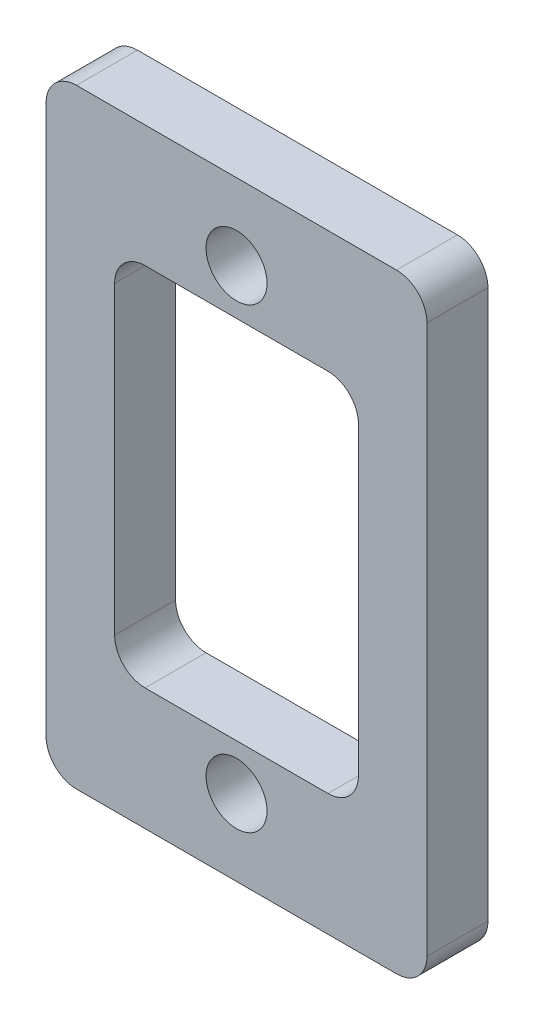
ISO-10303-21;
HEADER;
FILE_DESCRIPTION(('STEP AP214'),'2;1');
FILE_NAME('part.step','',(''),(''),'','','');
FILE_SCHEMA(('AUTOMOTIVE_DESIGN { 1 0 10303 214 1 1 1 1 }'));
ENDSEC;
DATA;
#1=APPLICATION_CONTEXT('core data for automotive mechanical design processes');
#2=APPLICATION_PROTOCOL_DEFINITION('international standard','automotive_design',2000,#1);
#3=PRODUCT_CONTEXT('',#1,'mechanical');
#4=PRODUCT('Part','Part','',(#3));
#5=PRODUCT_RELATED_PRODUCT_CATEGORY('part','',(#4));
#6=PRODUCT_DEFINITION_FORMATION('','',#4);
#7=PRODUCT_DEFINITION_CONTEXT('part definition',#1,'design');
#8=PRODUCT_DEFINITION('design','',#6,#7);
#9=PRODUCT_DEFINITION_SHAPE('','',#8);
#10=(LENGTH_UNIT() NAMED_UNIT(*) SI_UNIT(.MILLI.,.METRE.));
#11=(NAMED_UNIT(*) PLANE_ANGLE_UNIT() SI_UNIT($,.RADIAN.));
#12=(NAMED_UNIT(*) SI_UNIT($,.STERADIAN.) SOLID_ANGLE_UNIT());
#13=UNCERTAINTY_MEASURE_WITH_UNIT(LENGTH_MEASURE(1.E-05),#10,'distance_accuracy_value','');
#14=(GEOMETRIC_REPRESENTATION_CONTEXT(3) GLOBAL_UNCERTAINTY_ASSIGNED_CONTEXT((#13)) GLOBAL_UNIT_ASSIGNED_CONTEXT((#10,
#11,#12)) REPRESENTATION_CONTEXT('',''));
#15=CARTESIAN_POINT('',(0.,0.,0.));
#16=DIRECTION('',(0.,0.,1.));
#17=DIRECTION('',(1.,0.,0.));
#18=AXIS2_PLACEMENT_3D('',#15,#16,#17);
#19=CARTESIAN_POINT('',(12.5,-20.,4.));
#20=DIRECTION('',(-1.,0.,0.));
#21=DIRECTION('',(0.,0.,1.));
#22=AXIS2_PLACEMENT_3D('',#19,#20,#21);
#23=PLANE('',#22);
#24=DIRECTION('',(0.,1.,0.));
#25=VECTOR('',#24,1.);
#26=CARTESIAN_POINT('',(12.5,-20.,4.));
#27=LINE('',#26,#25);
#28=CARTESIAN_POINT('',(12.5,-18.,4.));
#29=VERTEX_POINT('',#28);
#30=CARTESIAN_POINT('',(12.5,18.,4.));
#31=VERTEX_POINT('',#30);
#32=EDGE_CURVE('E167',#29,#31,#27,.T.);
#33=ORIENTED_EDGE('',*,*,#32,.F.);
#34=DIRECTION('',(0.,0.,-1.));
#35=VECTOR('',#34,1.);
#36=CARTESIAN_POINT('',(12.5,-18.,4.));
#37=LINE('',#36,#35);
#38=CARTESIAN_POINT('',(12.5,-18.,0.));
#39=VERTEX_POINT('',#38);
#40=EDGE_CURVE('E152',#29,#39,#37,.T.);
#41=ORIENTED_EDGE('',*,*,#40,.T.);
#42=DIRECTION('',(0.,1.,0.));
#43=VECTOR('',#42,1.);
#44=CARTESIAN_POINT('',(12.5,-20.,0.));
#45=LINE('',#44,#43);
#46=CARTESIAN_POINT('',(12.5,18.,0.));
#47=VERTEX_POINT('',#46);
#48=EDGE_CURVE('E164',#39,#47,#45,.T.);
#49=ORIENTED_EDGE('',*,*,#48,.T.);
#50=DIRECTION('',(0.,0.,-1.));
#51=VECTOR('',#50,1.);
#52=CARTESIAN_POINT('',(12.5,18.,4.));
#53=LINE('',#52,#51);
#54=EDGE_CURVE('E169',#47,#31,#53,.F.);
#55=ORIENTED_EDGE('',*,*,#54,.T.);
#56=EDGE_LOOP('',(#33,#41,#49,#55));
#57=FACE_BOUND('',#56,.T.);
#58=ADVANCED_FACE('F35',(#57),#23,.F.);
#59=CARTESIAN_POINT('',(-12.5,20.,4.));
#60=DIRECTION('',(0.,-1.,0.));
#61=DIRECTION('',(0.,0.,-1.));
#62=AXIS2_PLACEMENT_3D('',#59,#60,#61);
#63=PLANE('',#62);
#64=DIRECTION('',(-1.,0.,0.));
#65=VECTOR('',#64,1.);
#66=CARTESIAN_POINT('',(-12.5,20.,0.));
#67=LINE('',#66,#65);
#68=CARTESIAN_POINT('',(10.5,20.,0.));
#69=VERTEX_POINT('',#68);
#70=CARTESIAN_POINT('',(-10.5,20.,0.));
#71=VERTEX_POINT('',#70);
#72=EDGE_CURVE('E173',#69,#71,#67,.T.);
#73=ORIENTED_EDGE('',*,*,#72,.T.);
#74=DIRECTION('',(0.,0.,-1.));
#75=VECTOR('',#74,1.);
#76=CARTESIAN_POINT('',(-10.5,20.,4.));
#77=LINE('',#76,#75);
#78=CARTESIAN_POINT('',(-10.5,20.,4.));
#79=VERTEX_POINT('',#78);
#80=EDGE_CURVE('E217',#71,#79,#77,.F.);
#81=ORIENTED_EDGE('',*,*,#80,.T.);
#82=DIRECTION('',(-1.,0.,0.));
#83=VECTOR('',#82,1.);
#84=CARTESIAN_POINT('',(-12.5,20.,4.));
#85=LINE('',#84,#83);
#86=CARTESIAN_POINT('',(10.5,20.,4.));
#87=VERTEX_POINT('',#86);
#88=EDGE_CURVE('E312',#87,#79,#85,.T.);
#89=ORIENTED_EDGE('',*,*,#88,.F.);
#90=DIRECTION('',(0.,0.,-1.));
#91=VECTOR('',#90,1.);
#92=CARTESIAN_POINT('',(10.5,20.,4.));
#93=LINE('',#92,#91);
#94=EDGE_CURVE('E214',#87,#69,#93,.T.);
#95=ORIENTED_EDGE('',*,*,#94,.T.);
#96=EDGE_LOOP('',(#73,#81,#89,#95));
#97=FACE_BOUND('',#96,.T.);
#98=ADVANCED_FACE('F336',(#97),#63,.F.);
#99=CARTESIAN_POINT('',(-12.5,-20.,4.));
#100=DIRECTION('',(1.,0.,0.));
#101=DIRECTION('',(0.,0.,-1.));
#102=AXIS2_PLACEMENT_3D('',#99,#100,#101);
#103=PLANE('',#102);
#104=DIRECTION('',(0.,-1.,0.));
#105=VECTOR('',#104,1.);
#106=CARTESIAN_POINT('',(-12.5,-20.,0.));
#107=LINE('',#106,#105);
#108=CARTESIAN_POINT('',(-12.5,18.,0.));
#109=VERTEX_POINT('',#108);
#110=CARTESIAN_POINT('',(-12.5,-18.,0.));
#111=VERTEX_POINT('',#110);
#112=EDGE_CURVE('E177',#109,#111,#107,.T.);
#113=ORIENTED_EDGE('',*,*,#112,.T.);
#114=DIRECTION('',(0.,0.,-1.));
#115=VECTOR('',#114,1.);
#116=CARTESIAN_POINT('',(-12.5,-18.,4.));
#117=LINE('',#116,#115);
#118=CARTESIAN_POINT('',(-12.5,-18.,4.));
#119=VERTEX_POINT('',#118);
#120=EDGE_CURVE('E212',#111,#119,#117,.F.);
#121=ORIENTED_EDGE('',*,*,#120,.T.);
#122=DIRECTION('',(0.,-1.,0.));
#123=VECTOR('',#122,1.);
#124=CARTESIAN_POINT('',(-12.5,-20.,4.));
#125=LINE('',#124,#123);
#126=CARTESIAN_POINT('',(-12.5,18.,4.));
#127=VERTEX_POINT('',#126);
#128=EDGE_CURVE('E314',#127,#119,#125,.T.);
#129=ORIENTED_EDGE('',*,*,#128,.F.);
#130=DIRECTION('',(0.,0.,-1.));
#131=VECTOR('',#130,1.);
#132=CARTESIAN_POINT('',(-12.5,18.,4.));
#133=LINE('',#132,#131);
#134=EDGE_CURVE('E209',#127,#109,#133,.T.);
#135=ORIENTED_EDGE('',*,*,#134,.T.);
#136=EDGE_LOOP('',(#113,#121,#129,#135));
#137=FACE_BOUND('',#136,.T.);
#138=ADVANCED_FACE('F329',(#137),#103,.F.);
#139=CARTESIAN_POINT('',(-12.5,-20.,4.));
#140=DIRECTION('',(0.,1.,0.));
#141=DIRECTION('',(0.,0.,1.));
#142=AXIS2_PLACEMENT_3D('',#139,#140,#141);
#143=PLANE('',#142);
#144=DIRECTION('',(1.,0.,0.));
#145=VECTOR('',#144,1.);
#146=CARTESIAN_POINT('',(-12.5,-20.,0.));
#147=LINE('',#146,#145);
#148=CARTESIAN_POINT('',(-10.5,-20.,0.));
#149=VERTEX_POINT('',#148);
#150=CARTESIAN_POINT('',(10.5,-20.,0.));
#151=VERTEX_POINT('',#150);
#152=EDGE_CURVE('E188',#149,#151,#147,.T.);
#153=ORIENTED_EDGE('',*,*,#152,.T.);
#154=DIRECTION('',(0.,0.,-1.));
#155=VECTOR('',#154,1.);
#156=CARTESIAN_POINT('',(10.5,-20.,4.));
#157=LINE('',#156,#155);
#158=CARTESIAN_POINT('',(10.5,-20.,4.));
#159=VERTEX_POINT('',#158);
#160=EDGE_CURVE('E153',#151,#159,#157,.F.);
#161=ORIENTED_EDGE('',*,*,#160,.T.);
#162=DIRECTION('',(1.,0.,0.));
#163=VECTOR('',#162,1.);
#164=CARTESIAN_POINT('',(-12.5,-20.,4.));
#165=LINE('',#164,#163);
#166=CARTESIAN_POINT('',(-10.5,-20.,4.));
#167=VERTEX_POINT('',#166);
#168=EDGE_CURVE('E183',#167,#159,#165,.T.);
#169=ORIENTED_EDGE('',*,*,#168,.F.);
#170=DIRECTION('',(0.,0.,-1.));
#171=VECTOR('',#170,1.);
#172=CARTESIAN_POINT('',(-10.5,-20.,4.));
#173=LINE('',#172,#171);
#174=EDGE_CURVE('E158',#167,#149,#173,.T.);
#175=ORIENTED_EDGE('',*,*,#174,.T.);
#176=EDGE_LOOP('',(#153,#161,#169,#175));
#177=FACE_BOUND('',#176,.T.);
#178=ADVANCED_FACE('F323',(#177),#143,.F.);
#179=CARTESIAN_POINT('',(0.,0.,4.));
#180=DIRECTION('',(0.,0.,-1.));
#181=DIRECTION('',(-1.,0.,0.));
#182=AXIS2_PLACEMENT_3D('',#179,#180,#181);
#183=PLANE('',#182);
#184=DIRECTION('',(-1.,0.,0.));
#185=VECTOR('',#184,1.);
#186=CARTESIAN_POINT('',(-8.,12.,4.));
#187=LINE('',#186,#185);
#188=CARTESIAN_POINT('',(6.,12.,4.));
#189=VERTEX_POINT('',#188);
#190=CARTESIAN_POINT('',(-6.,12.,4.));
#191=VERTEX_POINT('',#190);
#192=EDGE_CURVE('E271',#189,#191,#187,.T.);
#193=ORIENTED_EDGE('',*,*,#192,.F.);
#194=CARTESIAN_POINT('',(6.,10.,4.));
#195=DIRECTION('',(0.,0.,-1.));
#196=DIRECTION('',(-1.,0.,0.));
#197=AXIS2_PLACEMENT_3D('',#194,#195,#196);
#198=CIRCLE('',#197,2.);
#199=CARTESIAN_POINT('',(8.,10.,4.));
#200=VERTEX_POINT('',#199);
#201=EDGE_CURVE('E254',#189,#200,#198,.T.);
#202=ORIENTED_EDGE('',*,*,#201,.T.);
#203=DIRECTION('',(0.,1.,0.));
#204=VECTOR('',#203,1.);
#205=CARTESIAN_POINT('',(8.,-12.,4.));
#206=LINE('',#205,#204);
#207=CARTESIAN_POINT('',(8.,-10.,4.));
#208=VERTEX_POINT('',#207);
#209=EDGE_CURVE('E290',#208,#200,#206,.T.);
#210=ORIENTED_EDGE('',*,*,#209,.F.);
#211=CARTESIAN_POINT('',(6.,-10.,4.));
#212=DIRECTION('',(0.,0.,-1.));
#213=DIRECTION('',(-1.,0.,0.));
#214=AXIS2_PLACEMENT_3D('',#211,#212,#213);
#215=CIRCLE('',#214,2.);
#216=CARTESIAN_POINT('',(6.,-12.,4.));
#217=VERTEX_POINT('',#216);
#218=EDGE_CURVE('E50',#208,#217,#215,.T.);
#219=ORIENTED_EDGE('',*,*,#218,.T.);
#220=DIRECTION('',(1.,0.,0.));
#221=VECTOR('',#220,1.);
#222=CARTESIAN_POINT('',(-7.99999999999999,-12.,4.));
#223=LINE('',#222,#221);
#224=CARTESIAN_POINT('',(-5.99999999999999,-12.,4.));
#225=VERTEX_POINT('',#224);
#226=EDGE_CURVE('E266',#225,#217,#223,.T.);
#227=ORIENTED_EDGE('',*,*,#226,.F.);
#228=CARTESIAN_POINT('',(-5.99999999999999,-10.,4.));
#229=DIRECTION('',(0.,0.,-1.));
#230=DIRECTION('',(-1.,0.,0.));
#231=AXIS2_PLACEMENT_3D('',#228,#229,#230);
#232=CIRCLE('',#231,2.);
#233=CARTESIAN_POINT('',(-7.99999999999999,-10.,4.));
#234=VERTEX_POINT('',#233);
#235=EDGE_CURVE('E43',#225,#234,#232,.T.);
#236=ORIENTED_EDGE('',*,*,#235,.T.);
#237=DIRECTION('',(0.,-1.,0.));
#238=VECTOR('',#237,1.);
#239=CARTESIAN_POINT('',(-7.99999999999999,-12.,4.));
#240=LINE('',#239,#238);
#241=CARTESIAN_POINT('',(-8.,10.,4.));
#242=VERTEX_POINT('',#241);
#243=EDGE_CURVE('E265',#242,#234,#240,.T.);
#244=ORIENTED_EDGE('',*,*,#243,.F.);
#245=CARTESIAN_POINT('',(-6.,10.,4.));
#246=DIRECTION('',(0.,0.,-1.));
#247=DIRECTION('',(-1.,0.,0.));
#248=AXIS2_PLACEMENT_3D('',#245,#246,#247);
#249=CIRCLE('',#248,2.);
#250=EDGE_CURVE('E250',#242,#191,#249,.T.);
#251=ORIENTED_EDGE('',*,*,#250,.T.);
#252=EDGE_LOOP('',(#193,#202,#210,#219,#227,#236,#244,#251));
#253=FACE_BOUND('',#252,.T.);
#254=CARTESIAN_POINT('',(0.,15.,4.));
#255=DIRECTION('',(0.,0.,1.));
#256=DIRECTION('',(1.,0.,0.));
#257=AXIS2_PLACEMENT_3D('',#254,#255,#256);
#258=CIRCLE('',#257,2.);
#259=CARTESIAN_POINT('',(1.99999999999999,15.,4.));
#260=VERTEX_POINT('',#259);
#261=EDGE_CURVE('E191',#260,#260,#258,.T.);
#262=ORIENTED_EDGE('',*,*,#261,.F.);
#263=EDGE_LOOP('',(#262));
#264=FACE_BOUND('',#263,.T.);
#265=CARTESIAN_POINT('',(0.,-15.,4.));
#266=DIRECTION('',(0.,0.,1.));
#267=DIRECTION('',(1.,0.,0.));
#268=AXIS2_PLACEMENT_3D('',#265,#266,#267);
#269=CIRCLE('',#268,2.);
#270=CARTESIAN_POINT('',(2.,-15.,4.));
#271=VERTEX_POINT('',#270);
#272=EDGE_CURVE('E306',#271,#271,#269,.T.);
#273=ORIENTED_EDGE('',*,*,#272,.F.);
#274=EDGE_LOOP('',(#273));
#275=FACE_BOUND('',#274,.T.);
#276=ORIENTED_EDGE('',*,*,#168,.T.);
#277=CARTESIAN_POINT('',(10.5,-18.,4.));
#278=DIRECTION('',(0.,0.,-1.));
#279=DIRECTION('',(-1.,0.,0.));
#280=AXIS2_PLACEMENT_3D('',#277,#278,#279);
#281=CIRCLE('',#280,2.);
#282=EDGE_CURVE('E207',#159,#29,#281,.F.);
#283=ORIENTED_EDGE('',*,*,#282,.T.);
#284=ORIENTED_EDGE('',*,*,#32,.T.);
#285=CARTESIAN_POINT('',(10.5,18.,4.));
#286=DIRECTION('',(0.,0.,-1.));
#287=DIRECTION('',(-1.,0.,0.));
#288=AXIS2_PLACEMENT_3D('',#285,#286,#287);
#289=CIRCLE('',#288,2.);
#290=EDGE_CURVE('E201',#31,#87,#289,.F.);
#291=ORIENTED_EDGE('',*,*,#290,.T.);
#292=ORIENTED_EDGE('',*,*,#88,.T.);
#293=CARTESIAN_POINT('',(-10.5,18.,4.));
#294=DIRECTION('',(0.,0.,-1.));
#295=DIRECTION('',(-1.,0.,0.));
#296=AXIS2_PLACEMENT_3D('',#293,#294,#295);
#297=CIRCLE('',#296,2.);
#298=EDGE_CURVE('E203',#79,#127,#297,.F.);
#299=ORIENTED_EDGE('',*,*,#298,.T.);
#300=ORIENTED_EDGE('',*,*,#128,.T.);
#301=CARTESIAN_POINT('',(-10.5,-18.,4.));
#302=DIRECTION('',(0.,0.,-1.));
#303=DIRECTION('',(-1.,0.,0.));
#304=AXIS2_PLACEMENT_3D('',#301,#302,#303);
#305=CIRCLE('',#304,2.);
#306=EDGE_CURVE('E205',#119,#167,#305,.F.);
#307=ORIENTED_EDGE('',*,*,#306,.T.);
#308=EDGE_LOOP('',(#276,#283,#284,#291,#292,#299,#300,#307));
#309=FACE_BOUND('',#308,.T.);
#310=ADVANCED_FACE('F263',(#253,#264,#275,#309),#183,.F.);
#311=CARTESIAN_POINT('',(0.,0.,0.));
#312=DIRECTION('',(0.,0.,-1.));
#313=DIRECTION('',(-1.,0.,0.));
#314=AXIS2_PLACEMENT_3D('',#311,#312,#313);
#315=PLANE('',#314);
#316=DIRECTION('',(0.,-1.,0.));
#317=VECTOR('',#316,1.);
#318=CARTESIAN_POINT('',(8.,0.,0.));
#319=LINE('',#318,#317);
#320=CARTESIAN_POINT('',(8.,10.,0.));
#321=VERTEX_POINT('',#320);
#322=CARTESIAN_POINT('',(8.,-10.,0.));
#323=VERTEX_POINT('',#322);
#324=EDGE_CURVE('E228',#321,#323,#319,.T.);
#325=ORIENTED_EDGE('',*,*,#324,.F.);
#326=CARTESIAN_POINT('',(6.,10.,0.));
#327=DIRECTION('',(0.,0.,-1.));
#328=DIRECTION('',(-1.,0.,0.));
#329=AXIS2_PLACEMENT_3D('',#326,#327,#328);
#330=CIRCLE('',#329,2.);
#331=CARTESIAN_POINT('',(6.,12.,0.));
#332=VERTEX_POINT('',#331);
#333=EDGE_CURVE('E256',#321,#332,#330,.F.);
#334=ORIENTED_EDGE('',*,*,#333,.T.);
#335=DIRECTION('',(1.,0.,0.));
#336=VECTOR('',#335,1.);
#337=CARTESIAN_POINT('',(0.,12.,0.));
#338=LINE('',#337,#336);
#339=CARTESIAN_POINT('',(-6.,12.,0.));
#340=VERTEX_POINT('',#339);
#341=EDGE_CURVE('E219',#340,#332,#338,.T.);
#342=ORIENTED_EDGE('',*,*,#341,.F.);
#343=CARTESIAN_POINT('',(-6.,10.,0.));
#344=DIRECTION('',(0.,0.,-1.));
#345=DIRECTION('',(-1.,0.,0.));
#346=AXIS2_PLACEMENT_3D('',#343,#344,#345);
#347=CIRCLE('',#346,2.);
#348=CARTESIAN_POINT('',(-8.,10.,0.));
#349=VERTEX_POINT('',#348);
#350=EDGE_CURVE('E252',#340,#349,#347,.F.);
#351=ORIENTED_EDGE('',*,*,#350,.T.);
#352=DIRECTION('',(0.,1.,0.));
#353=VECTOR('',#352,1.);
#354=CARTESIAN_POINT('',(-8.,0.,0.));
#355=LINE('',#354,#353);
#356=CARTESIAN_POINT('',(-7.99999999999999,-10.,0.));
#357=VERTEX_POINT('',#356);
#358=EDGE_CURVE('E222',#357,#349,#355,.T.);
#359=ORIENTED_EDGE('',*,*,#358,.F.);
#360=CARTESIAN_POINT('',(-5.99999999999999,-10.,0.));
#361=DIRECTION('',(0.,0.,-1.));
#362=DIRECTION('',(-1.,0.,0.));
#363=AXIS2_PLACEMENT_3D('',#360,#361,#362);
#364=CIRCLE('',#363,2.);
#365=CARTESIAN_POINT('',(-5.99999999999999,-12.,0.));
#366=VERTEX_POINT('',#365);
#367=EDGE_CURVE('E11',#357,#366,#364,.F.);
#368=ORIENTED_EDGE('',*,*,#367,.T.);
#369=DIRECTION('',(-1.,0.,0.));
#370=VECTOR('',#369,1.);
#371=CARTESIAN_POINT('',(0.,-12.,0.));
#372=LINE('',#371,#370);
#373=CARTESIAN_POINT('',(6.,-12.,0.));
#374=VERTEX_POINT('',#373);
#375=EDGE_CURVE('E225',#374,#366,#372,.T.);
#376=ORIENTED_EDGE('',*,*,#375,.F.);
#377=CARTESIAN_POINT('',(6.,-10.,0.));
#378=DIRECTION('',(0.,0.,-1.));
#379=DIRECTION('',(-1.,0.,0.));
#380=AXIS2_PLACEMENT_3D('',#377,#378,#379);
#381=CIRCLE('',#380,2.);
#382=EDGE_CURVE('E259',#374,#323,#381,.F.);
#383=ORIENTED_EDGE('',*,*,#382,.T.);
#384=EDGE_LOOP('',(#325,#334,#342,#351,#359,#368,#376,#383));
#385=FACE_BOUND('',#384,.T.);
#386=CARTESIAN_POINT('',(0.,15.,0.));
#387=DIRECTION('',(0.,0.,-1.));
#388=DIRECTION('',(-1.,0.,0.));
#389=AXIS2_PLACEMENT_3D('',#386,#387,#388);
#390=CIRCLE('',#389,2.);
#391=CARTESIAN_POINT('',(-2.00000000000001,15.,0.));
#392=VERTEX_POINT('',#391);
#393=EDGE_CURVE('E174',#392,#392,#390,.T.);
#394=ORIENTED_EDGE('',*,*,#393,.F.);
#395=EDGE_LOOP('',(#394));
#396=FACE_BOUND('',#395,.T.);
#397=CARTESIAN_POINT('',(0.,-15.,0.));
#398=DIRECTION('',(0.,0.,-1.));
#399=DIRECTION('',(-1.,0.,0.));
#400=AXIS2_PLACEMENT_3D('',#397,#398,#399);
#401=CIRCLE('',#400,2.);
#402=CARTESIAN_POINT('',(-2.,-15.,0.));
#403=VERTEX_POINT('',#402);
#404=EDGE_CURVE('E180',#403,#403,#401,.T.);
#405=ORIENTED_EDGE('',*,*,#404,.F.);
#406=EDGE_LOOP('',(#405));
#407=FACE_BOUND('',#406,.T.);
#408=ORIENTED_EDGE('',*,*,#48,.F.);
#409=CARTESIAN_POINT('',(10.5,-18.,0.));
#410=DIRECTION('',(0.,0.,-1.));
#411=DIRECTION('',(-1.,0.,0.));
#412=AXIS2_PLACEMENT_3D('',#409,#410,#411);
#413=CIRCLE('',#412,2.);
#414=EDGE_CURVE('E148',#39,#151,#413,.T.);
#415=ORIENTED_EDGE('',*,*,#414,.T.);
#416=ORIENTED_EDGE('',*,*,#152,.F.);
#417=CARTESIAN_POINT('',(-10.5,-18.,0.));
#418=DIRECTION('',(0.,0.,-1.));
#419=DIRECTION('',(-1.,0.,0.));
#420=AXIS2_PLACEMENT_3D('',#417,#418,#419);
#421=CIRCLE('',#420,2.);
#422=EDGE_CURVE('E159',#149,#111,#421,.T.);
#423=ORIENTED_EDGE('',*,*,#422,.T.);
#424=ORIENTED_EDGE('',*,*,#112,.F.);
#425=CARTESIAN_POINT('',(-10.5,18.,0.));
#426=DIRECTION('',(0.,0.,-1.));
#427=DIRECTION('',(-1.,0.,0.));
#428=AXIS2_PLACEMENT_3D('',#425,#426,#427);
#429=CIRCLE('',#428,2.);
#430=EDGE_CURVE('E195',#109,#71,#429,.T.);
#431=ORIENTED_EDGE('',*,*,#430,.T.);
#432=ORIENTED_EDGE('',*,*,#72,.F.);
#433=CARTESIAN_POINT('',(10.5,18.,0.));
#434=DIRECTION('',(0.,0.,-1.));
#435=DIRECTION('',(-1.,0.,0.));
#436=AXIS2_PLACEMENT_3D('',#433,#434,#435);
#437=CIRCLE('',#436,2.);
#438=EDGE_CURVE('E168',#69,#47,#437,.T.);
#439=ORIENTED_EDGE('',*,*,#438,.T.);
#440=EDGE_LOOP('',(#408,#415,#416,#423,#424,#431,#432,#439));
#441=FACE_BOUND('',#440,.T.);
#442=ADVANCED_FACE('F171',(#385,#396,#407,#441),#315,.T.);
#443=CARTESIAN_POINT('',(0.,-15.,-6.));
#444=DIRECTION('',(0.,0.,1.));
#445=DIRECTION('',(1.,0.,0.));
#446=AXIS2_PLACEMENT_3D('',#443,#444,#445);
#447=CYLINDRICAL_SURFACE('',#446,2.);
#448=ORIENTED_EDGE('',*,*,#404,.T.);
#449=EDGE_LOOP('',(#448));
#450=FACE_BOUND('',#449,.T.);
#451=ORIENTED_EDGE('',*,*,#272,.T.);
#452=EDGE_LOOP('',(#451));
#453=FACE_BOUND('',#452,.T.);
#454=ADVANCED_FACE('F396',(#450,#453),#447,.F.);
#455=CARTESIAN_POINT('',(0.,15.,-6.));
#456=DIRECTION('',(0.,0.,1.));
#457=DIRECTION('',(1.,0.,0.));
#458=AXIS2_PLACEMENT_3D('',#455,#456,#457);
#459=CYLINDRICAL_SURFACE('',#458,2.);
#460=ORIENTED_EDGE('',*,*,#393,.T.);
#461=EDGE_LOOP('',(#460));
#462=FACE_BOUND('',#461,.T.);
#463=ORIENTED_EDGE('',*,*,#261,.T.);
#464=EDGE_LOOP('',(#463));
#465=FACE_BOUND('',#464,.T.);
#466=ADVANCED_FACE('F361',(#462,#465),#459,.F.);
#467=CARTESIAN_POINT('',(10.5,-18.,4.));
#468=DIRECTION('',(0.,0.,-1.));
#469=DIRECTION('',(-1.,0.,0.));
#470=AXIS2_PLACEMENT_3D('',#467,#468,#469);
#471=CYLINDRICAL_SURFACE('',#470,2.);
#472=ORIENTED_EDGE('',*,*,#282,.F.);
#473=ORIENTED_EDGE('',*,*,#160,.F.);
#474=ORIENTED_EDGE('',*,*,#414,.F.);
#475=ORIENTED_EDGE('',*,*,#40,.F.);
#476=EDGE_LOOP('',(#472,#473,#474,#475));
#477=FACE_BOUND('',#476,.T.);
#478=ADVANCED_FACE('F151',(#477),#471,.T.);
#479=CARTESIAN_POINT('',(-10.5,-18.,4.));
#480=DIRECTION('',(0.,0.,-1.));
#481=DIRECTION('',(-1.,0.,0.));
#482=AXIS2_PLACEMENT_3D('',#479,#480,#481);
#483=CYLINDRICAL_SURFACE('',#482,2.);
#484=ORIENTED_EDGE('',*,*,#306,.F.);
#485=ORIENTED_EDGE('',*,*,#120,.F.);
#486=ORIENTED_EDGE('',*,*,#422,.F.);
#487=ORIENTED_EDGE('',*,*,#174,.F.);
#488=EDGE_LOOP('',(#484,#485,#486,#487));
#489=FACE_BOUND('',#488,.T.);
#490=ADVANCED_FACE('F325',(#489),#483,.T.);
#491=CARTESIAN_POINT('',(-10.5,18.,4.));
#492=DIRECTION('',(0.,0.,-1.));
#493=DIRECTION('',(-1.,0.,0.));
#494=AXIS2_PLACEMENT_3D('',#491,#492,#493);
#495=CYLINDRICAL_SURFACE('',#494,2.);
#496=ORIENTED_EDGE('',*,*,#298,.F.);
#497=ORIENTED_EDGE('',*,*,#80,.F.);
#498=ORIENTED_EDGE('',*,*,#430,.F.);
#499=ORIENTED_EDGE('',*,*,#134,.F.);
#500=EDGE_LOOP('',(#496,#497,#498,#499));
#501=FACE_BOUND('',#500,.T.);
#502=ADVANCED_FACE('F333',(#501),#495,.T.);
#503=CARTESIAN_POINT('',(10.5,18.,4.));
#504=DIRECTION('',(0.,0.,-1.));
#505=DIRECTION('',(-1.,0.,0.));
#506=AXIS2_PLACEMENT_3D('',#503,#504,#505);
#507=CYLINDRICAL_SURFACE('',#506,2.);
#508=ORIENTED_EDGE('',*,*,#290,.F.);
#509=ORIENTED_EDGE('',*,*,#54,.F.);
#510=ORIENTED_EDGE('',*,*,#438,.F.);
#511=ORIENTED_EDGE('',*,*,#94,.F.);
#512=EDGE_LOOP('',(#508,#509,#510,#511));
#513=FACE_BOUND('',#512,.T.);
#514=ADVANCED_FACE('F341',(#513),#507,.T.);
#515=CARTESIAN_POINT('',(8.,-12.,-6.));
#516=DIRECTION('',(1.,0.,0.));
#517=DIRECTION('',(0.,0.,-1.));
#518=AXIS2_PLACEMENT_3D('',#515,#516,#517);
#519=PLANE('',#518);
#520=ORIENTED_EDGE('',*,*,#209,.T.);
#521=DIRECTION('',(0.,0.,1.));
#522=VECTOR('',#521,1.);
#523=CARTESIAN_POINT('',(8.,10.,0.));
#524=LINE('',#523,#522);
#525=EDGE_CURVE('E244',#200,#321,#524,.F.);
#526=ORIENTED_EDGE('',*,*,#525,.T.);
#527=ORIENTED_EDGE('',*,*,#324,.T.);
#528=DIRECTION('',(0.,0.,1.));
#529=VECTOR('',#528,1.);
#530=CARTESIAN_POINT('',(8.,-10.,4.));
#531=LINE('',#530,#529);
#532=EDGE_CURVE('E241',#323,#208,#531,.T.);
#533=ORIENTED_EDGE('',*,*,#532,.T.);
#534=EDGE_LOOP('',(#520,#526,#527,#533));
#535=FACE_BOUND('',#534,.T.);
#536=ADVANCED_FACE('F288',(#535),#519,.F.);
#537=CARTESIAN_POINT('',(-7.99999999999999,-12.,-6.));
#538=DIRECTION('',(0.,-1.,0.));
#539=DIRECTION('',(1.,0.,0.));
#540=AXIS2_PLACEMENT_3D('',#537,#538,#539);
#541=PLANE('',#540);
#542=ORIENTED_EDGE('',*,*,#226,.T.);
#543=DIRECTION('',(0.,0.,1.));
#544=VECTOR('',#543,1.);
#545=CARTESIAN_POINT('',(6.,-12.,0.));
#546=LINE('',#545,#544);
#547=EDGE_CURVE('E248',#217,#374,#546,.F.);
#548=ORIENTED_EDGE('',*,*,#547,.T.);
#549=ORIENTED_EDGE('',*,*,#375,.T.);
#550=DIRECTION('',(0.,0.,1.));
#551=VECTOR('',#550,1.);
#552=CARTESIAN_POINT('',(-5.99999999999999,-12.,4.));
#553=LINE('',#552,#551);
#554=EDGE_CURVE('E246',#366,#225,#553,.T.);
#555=ORIENTED_EDGE('',*,*,#554,.T.);
#556=EDGE_LOOP('',(#542,#548,#549,#555));
#557=FACE_BOUND('',#556,.T.);
#558=ADVANCED_FACE('F280',(#557),#541,.F.);
#559=CARTESIAN_POINT('',(-7.99999999999999,-12.,-6.));
#560=DIRECTION('',(-1.,0.,0.));
#561=DIRECTION('',(0.,-1.,0.));
#562=AXIS2_PLACEMENT_3D('',#559,#560,#561);
#563=PLANE('',#562);
#564=ORIENTED_EDGE('',*,*,#358,.T.);
#565=DIRECTION('',(0.,0.,1.));
#566=VECTOR('',#565,1.);
#567=CARTESIAN_POINT('',(-8.,10.,4.));
#568=LINE('',#567,#566);
#569=EDGE_CURVE('E233',#349,#242,#568,.T.);
#570=ORIENTED_EDGE('',*,*,#569,.T.);
#571=ORIENTED_EDGE('',*,*,#243,.T.);
#572=DIRECTION('',(0.,0.,1.));
#573=VECTOR('',#572,1.);
#574=CARTESIAN_POINT('',(-7.99999999999999,-10.,0.));
#575=LINE('',#574,#573);
#576=EDGE_CURVE('E231',#234,#357,#575,.F.);
#577=ORIENTED_EDGE('',*,*,#576,.T.);
#578=EDGE_LOOP('',(#564,#570,#571,#577));
#579=FACE_BOUND('',#578,.T.);
#580=ADVANCED_FACE('F268',(#579),#563,.F.);
#581=CARTESIAN_POINT('',(-8.,12.,-6.));
#582=DIRECTION('',(0.,1.,0.));
#583=DIRECTION('',(-1.,0.,0.));
#584=AXIS2_PLACEMENT_3D('',#581,#582,#583);
#585=PLANE('',#584);
#586=ORIENTED_EDGE('',*,*,#192,.T.);
#587=DIRECTION('',(0.,0.,1.));
#588=VECTOR('',#587,1.);
#589=CARTESIAN_POINT('',(-6.,12.,0.));
#590=LINE('',#589,#588);
#591=EDGE_CURVE('E239',#191,#340,#590,.F.);
#592=ORIENTED_EDGE('',*,*,#591,.T.);
#593=ORIENTED_EDGE('',*,*,#341,.T.);
#594=DIRECTION('',(0.,0.,1.));
#595=VECTOR('',#594,1.);
#596=CARTESIAN_POINT('',(6.,12.,4.));
#597=LINE('',#596,#595);
#598=EDGE_CURVE('E236',#332,#189,#597,.T.);
#599=ORIENTED_EDGE('',*,*,#598,.T.);
#600=EDGE_LOOP('',(#586,#592,#593,#599));
#601=FACE_BOUND('',#600,.T.);
#602=ADVANCED_FACE('F298',(#601),#585,.F.);
#603=CARTESIAN_POINT('',(-6.,10.,-6.));
#604=DIRECTION('',(0.,0.,-1.));
#605=DIRECTION('',(-1.,0.,0.));
#606=AXIS2_PLACEMENT_3D('',#603,#604,#605);
#607=CYLINDRICAL_SURFACE('',#606,2.);
#608=ORIENTED_EDGE('',*,*,#350,.F.);
#609=ORIENTED_EDGE('',*,*,#591,.F.);
#610=ORIENTED_EDGE('',*,*,#250,.F.);
#611=ORIENTED_EDGE('',*,*,#569,.F.);
#612=EDGE_LOOP('',(#608,#609,#610,#611));
#613=FACE_BOUND('',#612,.T.);
#614=ADVANCED_FACE('F301',(#613),#607,.F.);
#615=CARTESIAN_POINT('',(6.,10.,-6.));
#616=DIRECTION('',(0.,0.,-1.));
#617=DIRECTION('',(-1.,0.,0.));
#618=AXIS2_PLACEMENT_3D('',#615,#616,#617);
#619=CYLINDRICAL_SURFACE('',#618,2.);
#620=ORIENTED_EDGE('',*,*,#333,.F.);
#621=ORIENTED_EDGE('',*,*,#525,.F.);
#622=ORIENTED_EDGE('',*,*,#201,.F.);
#623=ORIENTED_EDGE('',*,*,#598,.F.);
#624=EDGE_LOOP('',(#620,#621,#622,#623));
#625=FACE_BOUND('',#624,.T.);
#626=ADVANCED_FACE('F292',(#625),#619,.F.);
#627=CARTESIAN_POINT('',(6.,-10.,-6.));
#628=DIRECTION('',(0.,0.,-1.));
#629=DIRECTION('',(-1.,0.,0.));
#630=AXIS2_PLACEMENT_3D('',#627,#628,#629);
#631=CYLINDRICAL_SURFACE('',#630,2.);
#632=ORIENTED_EDGE('',*,*,#382,.F.);
#633=ORIENTED_EDGE('',*,*,#547,.F.);
#634=ORIENTED_EDGE('',*,*,#218,.F.);
#635=ORIENTED_EDGE('',*,*,#532,.F.);
#636=EDGE_LOOP('',(#632,#633,#634,#635));
#637=FACE_BOUND('',#636,.T.);
#638=ADVANCED_FACE('F283',(#637),#631,.F.);
#639=CARTESIAN_POINT('',(-5.99999999999999,-10.,-6.));
#640=DIRECTION('',(0.,0.,-1.));
#641=DIRECTION('',(-1.,0.,0.));
#642=AXIS2_PLACEMENT_3D('',#639,#640,#641);
#643=CYLINDRICAL_SURFACE('',#642,2.);
#644=ORIENTED_EDGE('',*,*,#367,.F.);
#645=ORIENTED_EDGE('',*,*,#576,.F.);
#646=ORIENTED_EDGE('',*,*,#235,.F.);
#647=ORIENTED_EDGE('',*,*,#554,.F.);
#648=EDGE_LOOP('',(#644,#645,#646,#647));
#649=FACE_BOUND('',#648,.T.);
#650=ADVANCED_FACE('F37',(#649),#643,.F.);
#651=CLOSED_SHELL('',(#58,#98,#138,#178,#310,#442,#454,#466,#478,#490,#502,#514,#536,#558,#580,
#602,#614,#626,#638,#650));
#652=MANIFOLD_SOLID_BREP('B2',#651);
#653=ADVANCED_BREP_SHAPE_REPRESENTATION('',(#18,#652),#14);
#654=SHAPE_DEFINITION_REPRESENTATION(#9,#653);
ENDSEC;
END-ISO-10303-21;
